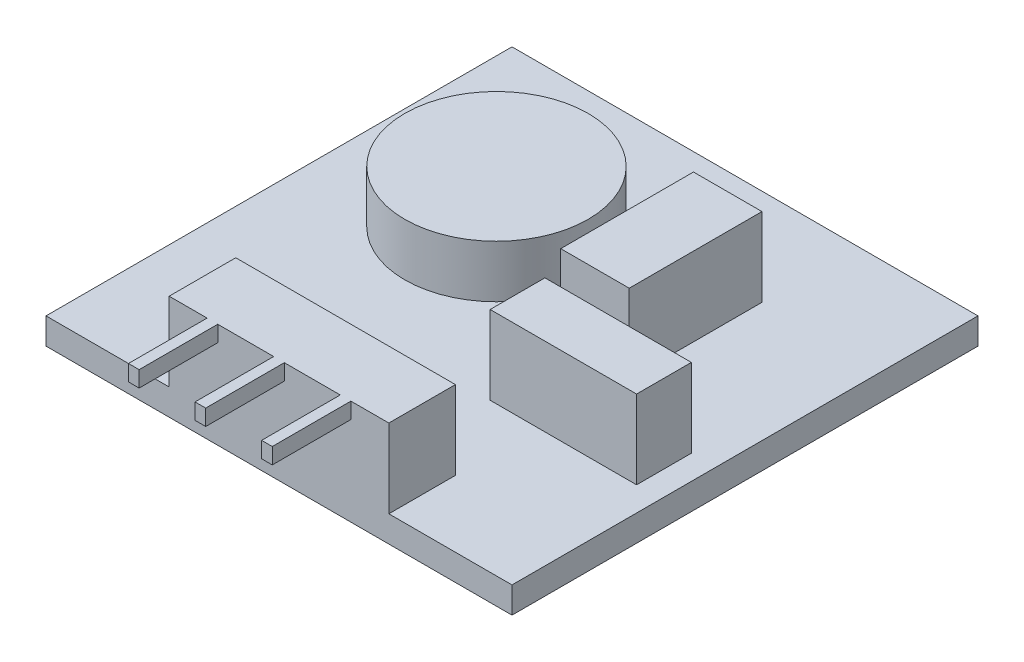
ISO-10303-21;
HEADER;
FILE_DESCRIPTION(('STEP AP214'),'2;1');
FILE_NAME('part.step','',(''),(''),'','','');
FILE_SCHEMA(('AUTOMOTIVE_DESIGN { 1 0 10303 214 1 1 1 1 }'));
ENDSEC;
DATA;
#1=APPLICATION_CONTEXT('core data for automotive mechanical design processes');
#2=APPLICATION_PROTOCOL_DEFINITION('international standard','automotive_design',2000,#1);
#3=PRODUCT_CONTEXT('',#1,'mechanical');
#4=PRODUCT('Part','Part','',(#3));
#5=PRODUCT_RELATED_PRODUCT_CATEGORY('part','',(#4));
#6=PRODUCT_DEFINITION_FORMATION('','',#4);
#7=PRODUCT_DEFINITION_CONTEXT('part definition',#1,'design');
#8=PRODUCT_DEFINITION('design','',#6,#7);
#9=PRODUCT_DEFINITION_SHAPE('','',#8);
#10=(LENGTH_UNIT() NAMED_UNIT(*) SI_UNIT(.MILLI.,.METRE.));
#11=(NAMED_UNIT(*) PLANE_ANGLE_UNIT() SI_UNIT($,.RADIAN.));
#12=(NAMED_UNIT(*) SI_UNIT($,.STERADIAN.) SOLID_ANGLE_UNIT());
#13=UNCERTAINTY_MEASURE_WITH_UNIT(LENGTH_MEASURE(1.E-05),#10,'distance_accuracy_value','');
#14=(GEOMETRIC_REPRESENTATION_CONTEXT(3) GLOBAL_UNCERTAINTY_ASSIGNED_CONTEXT((#13)) GLOBAL_UNIT_ASSIGNED_CONTEXT((#10,
#11,#12)) REPRESENTATION_CONTEXT('',''));
#15=CARTESIAN_POINT('',(0.,0.,0.));
#16=DIRECTION('',(0.,0.,1.));
#17=DIRECTION('',(1.,0.,0.));
#18=AXIS2_PLACEMENT_3D('',#15,#16,#17);
#19=CARTESIAN_POINT('',(-8.89,1.,8.89));
#20=DIRECTION('',(0.,0.,-1.));
#21=DIRECTION('',(-1.,0.,0.));
#22=AXIS2_PLACEMENT_3D('',#19,#20,#21);
#23=PLANE('',#22);
#24=DIRECTION('',(0.,1.,0.));
#25=VECTOR('',#24,1.);
#26=CARTESIAN_POINT('',(2.7432,4.,8.89));
#27=LINE('',#26,#25);
#28=CARTESIAN_POINT('',(2.7432,3.3904,8.89));
#29=VERTEX_POINT('',#28);
#30=CARTESIAN_POINT('',(2.7432,4.,8.89));
#31=VERTEX_POINT('',#30);
#32=EDGE_CURVE('E51',#29,#31,#27,.T.);
#33=ORIENTED_EDGE('',*,*,#32,.F.);
#34=DIRECTION('',(1.,0.,0.));
#35=VECTOR('',#34,1.);
#36=CARTESIAN_POINT('',(2.3368,3.3904,8.89));
#37=LINE('',#36,#35);
#38=CARTESIAN_POINT('',(2.3368,3.3904,8.89));
#39=VERTEX_POINT('',#38);
#40=EDGE_CURVE('E242',#39,#29,#37,.T.);
#41=ORIENTED_EDGE('',*,*,#40,.F.);
#42=DIRECTION('',(0.,-1.,0.));
#43=VECTOR('',#42,1.);
#44=CARTESIAN_POINT('',(2.3368,4.,8.89));
#45=LINE('',#44,#43);
#46=CARTESIAN_POINT('',(2.3368,4.,8.89));
#47=VERTEX_POINT('',#46);
#48=EDGE_CURVE('E680',#47,#39,#45,.T.);
#49=ORIENTED_EDGE('',*,*,#48,.F.);
#50=DIRECTION('',(1.,0.,0.));
#51=VECTOR('',#50,1.);
#52=CARTESIAN_POINT('',(-4.191,4.,8.89));
#53=LINE('',#52,#51);
#54=CARTESIAN_POINT('',(0.203200000000001,4.,8.89));
#55=VERTEX_POINT('',#54);
#56=EDGE_CURVE('E294',#55,#47,#53,.T.);
#57=ORIENTED_EDGE('',*,*,#56,.F.);
#58=DIRECTION('',(0.,1.,0.));
#59=VECTOR('',#58,1.);
#60=CARTESIAN_POINT('',(0.203200000000002,4.,8.89));
#61=LINE('',#60,#59);
#62=CARTESIAN_POINT('',(0.203200000000002,3.3904,8.89));
#63=VERTEX_POINT('',#62);
#64=EDGE_CURVE('E59',#63,#55,#61,.T.);
#65=ORIENTED_EDGE('',*,*,#64,.F.);
#66=DIRECTION('',(1.,0.,0.));
#67=VECTOR('',#66,1.);
#68=CARTESIAN_POINT('',(-0.203199999999998,3.3904,8.89));
#69=LINE('',#68,#67);
#70=CARTESIAN_POINT('',(-0.203199999999998,3.3904,8.89));
#71=VERTEX_POINT('',#70);
#72=EDGE_CURVE('E256',#71,#63,#69,.T.);
#73=ORIENTED_EDGE('',*,*,#72,.F.);
#74=DIRECTION('',(0.,-1.,0.));
#75=VECTOR('',#74,1.);
#76=CARTESIAN_POINT('',(-0.203199999999998,4.,8.89));
#77=LINE('',#76,#75);
#78=CARTESIAN_POINT('',(-0.203199999999998,4.,8.89));
#79=VERTEX_POINT('',#78);
#80=EDGE_CURVE('E246',#79,#71,#77,.T.);
#81=ORIENTED_EDGE('',*,*,#80,.F.);
#82=CARTESIAN_POINT('',(-2.3368,4.,8.89));
#83=VERTEX_POINT('',#82);
#84=EDGE_CURVE('E295',#83,#79,#53,.T.);
#85=ORIENTED_EDGE('',*,*,#84,.F.);
#86=DIRECTION('',(0.,1.,0.));
#87=VECTOR('',#86,1.);
#88=CARTESIAN_POINT('',(-2.3368,4.,8.89));
#89=LINE('',#88,#87);
#90=CARTESIAN_POINT('',(-2.3368,3.3904,8.89));
#91=VERTEX_POINT('',#90);
#92=EDGE_CURVE('E273',#91,#83,#89,.T.);
#93=ORIENTED_EDGE('',*,*,#92,.F.);
#94=DIRECTION('',(1.,0.,0.));
#95=VECTOR('',#94,1.);
#96=CARTESIAN_POINT('',(-2.7432,3.3904,8.89));
#97=LINE('',#96,#95);
#98=CARTESIAN_POINT('',(-2.7432,3.3904,8.89));
#99=VERTEX_POINT('',#98);
#100=EDGE_CURVE('E278',#99,#91,#97,.T.);
#101=ORIENTED_EDGE('',*,*,#100,.F.);
#102=DIRECTION('',(0.,-1.,0.));
#103=VECTOR('',#102,1.);
#104=CARTESIAN_POINT('',(-2.7432,4.,8.89));
#105=LINE('',#104,#103);
#106=CARTESIAN_POINT('',(-2.7432,4.,8.89));
#107=VERTEX_POINT('',#106);
#108=EDGE_CURVE('E291',#107,#99,#105,.T.);
#109=ORIENTED_EDGE('',*,*,#108,.F.);
#110=CARTESIAN_POINT('',(-4.191,4.,8.89));
#111=VERTEX_POINT('',#110);
#112=EDGE_CURVE('E309',#111,#107,#53,.T.);
#113=ORIENTED_EDGE('',*,*,#112,.F.);
#114=DIRECTION('',(0.,-1.,0.));
#115=VECTOR('',#114,1.);
#116=CARTESIAN_POINT('',(-4.191,4.,8.89));
#117=LINE('',#116,#115);
#118=CARTESIAN_POINT('',(-4.191,1.,8.89));
#119=VERTEX_POINT('',#118);
#120=EDGE_CURVE('E418',#111,#119,#117,.T.);
#121=ORIENTED_EDGE('',*,*,#120,.T.);
#122=DIRECTION('',(1.,0.,0.));
#123=VECTOR('',#122,1.);
#124=CARTESIAN_POINT('',(-8.89,1.,8.89));
#125=LINE('',#124,#123);
#126=CARTESIAN_POINT('',(-8.89,1.,8.89));
#127=VERTEX_POINT('',#126);
#128=EDGE_CURVE('E324',#127,#119,#125,.T.);
#129=ORIENTED_EDGE('',*,*,#128,.F.);
#130=DIRECTION('',(0.,-1.,0.));
#131=VECTOR('',#130,1.);
#132=CARTESIAN_POINT('',(-8.89,1.,8.89));
#133=LINE('',#132,#131);
#134=CARTESIAN_POINT('',(-8.89,0.,8.89));
#135=VERTEX_POINT('',#134);
#136=EDGE_CURVE('E318',#127,#135,#133,.T.);
#137=ORIENTED_EDGE('',*,*,#136,.T.);
#138=DIRECTION('',(1.,0.,0.));
#139=VECTOR('',#138,1.);
#140=CARTESIAN_POINT('',(-8.89,0.,8.89));
#141=LINE('',#140,#139);
#142=CARTESIAN_POINT('',(8.89,0.,8.89));
#143=VERTEX_POINT('',#142);
#144=EDGE_CURVE('E325',#135,#143,#141,.T.);
#145=ORIENTED_EDGE('',*,*,#144,.T.);
#146=DIRECTION('',(0.,-1.,0.));
#147=VECTOR('',#146,1.);
#148=CARTESIAN_POINT('',(8.89,1.,8.89));
#149=LINE('',#148,#147);
#150=CARTESIAN_POINT('',(8.89,1.,8.89));
#151=VERTEX_POINT('',#150);
#152=EDGE_CURVE('E321',#151,#143,#149,.T.);
#153=ORIENTED_EDGE('',*,*,#152,.F.);
#154=CARTESIAN_POINT('',(4.191,1.,8.89));
#155=VERTEX_POINT('',#154);
#156=EDGE_CURVE('E337',#155,#151,#125,.T.);
#157=ORIENTED_EDGE('',*,*,#156,.F.);
#158=DIRECTION('',(0.,-1.,0.));
#159=VECTOR('',#158,1.);
#160=CARTESIAN_POINT('',(4.191,4.,8.89));
#161=LINE('',#160,#159);
#162=CARTESIAN_POINT('',(4.191,4.,8.89));
#163=VERTEX_POINT('',#162);
#164=EDGE_CURVE('E311',#163,#155,#161,.T.);
#165=ORIENTED_EDGE('',*,*,#164,.F.);
#166=EDGE_CURVE('E37',#31,#163,#53,.T.);
#167=ORIENTED_EDGE('',*,*,#166,.F.);
#168=EDGE_LOOP('',(#33,#41,#49,#57,#65,#73,#81,#85,#93,#101,#109,#113,#121,#129,#137,#145,#153,
#157,#165,#167));
#169=FACE_BOUND('',#168,.T.);
#170=ADVANCED_FACE('F33',(#169),#23,.F.);
#171=CARTESIAN_POINT('',(0.,1.,0.));
#172=DIRECTION('',(0.,-1.,0.));
#173=DIRECTION('',(0.,0.,-1.));
#174=AXIS2_PLACEMENT_3D('',#171,#172,#173);
#175=PLANE('',#174);
#176=DIRECTION('',(0.,0.,-1.));
#177=VECTOR('',#176,1.);
#178=CARTESIAN_POINT('',(4.32151695929847,1.,-0.150750591603429));
#179=LINE('',#178,#177);
#180=CARTESIAN_POINT('',(4.32151695929847,1.,-0.150750591603429));
#181=VERTEX_POINT('',#180);
#182=CARTESIAN_POINT('',(4.32151695929847,1.,-5.21597046947885));
#183=VERTEX_POINT('',#182);
#184=EDGE_CURVE('E402',#181,#183,#179,.T.);
#185=ORIENTED_EDGE('',*,*,#184,.F.);
#186=DIRECTION('',(1.,0.,0.));
#187=VECTOR('',#186,1.);
#188=CARTESIAN_POINT('',(1.70850670483893,1.,-0.150750591603429));
#189=LINE('',#188,#187);
#190=CARTESIAN_POINT('',(1.70850670483893,1.,-0.150750591603429));
#191=VERTEX_POINT('',#190);
#192=EDGE_CURVE('E392',#191,#181,#189,.T.);
#193=ORIENTED_EDGE('',*,*,#192,.F.);
#194=DIRECTION('',(0.,0.,1.));
#195=VECTOR('',#194,1.);
#196=CARTESIAN_POINT('',(1.70850670483893,1.,-0.150750591603429));
#197=LINE('',#196,#195);
#198=CARTESIAN_POINT('',(1.70850670483893,1.,-5.21597046947885));
#199=VERTEX_POINT('',#198);
#200=EDGE_CURVE('E396',#199,#191,#197,.T.);
#201=ORIENTED_EDGE('',*,*,#200,.F.);
#202=DIRECTION('',(-1.,0.,0.));
#203=VECTOR('',#202,1.);
#204=CARTESIAN_POINT('',(1.70850670483893,1.,-5.21597046947885));
#205=LINE('',#204,#203);
#206=EDGE_CURVE('E399',#183,#199,#205,.T.);
#207=ORIENTED_EDGE('',*,*,#206,.F.);
#208=EDGE_LOOP('',(#185,#193,#201,#207));
#209=FACE_BOUND('',#208,.T.);
#210=CARTESIAN_POINT('',(-3.23611269975375,1.,-2.64316037278023));
#211=DIRECTION('',(0.,-1.,0.));
#212=DIRECTION('',(0.,0.,-1.));
#213=AXIS2_PLACEMENT_3D('',#210,#211,#212);
#214=CIRCLE('',#213,3.5);
#215=CARTESIAN_POINT('',(-3.23611269975375,1.,-6.14316037278023));
#216=VERTEX_POINT('',#215);
#217=EDGE_CURVE('E11',#216,#216,#214,.F.);
#218=ORIENTED_EDGE('',*,*,#217,.F.);
#219=EDGE_LOOP('',(#218));
#220=FACE_BOUND('',#219,.T.);
#221=DIRECTION('',(0.,0.,-1.));
#222=VECTOR('',#221,1.);
#223=CARTESIAN_POINT('',(7.95963123666137,1.,1.11555437786543));
#224=LINE('',#223,#222);
#225=CARTESIAN_POINT('',(7.95963123666137,1.,3.20596258143306));
#226=VERTEX_POINT('',#225);
#227=CARTESIAN_POINT('',(7.95963123666137,1.,1.11555437786543));
#228=VERTEX_POINT('',#227);
#229=EDGE_CURVE('E369',#226,#228,#224,.T.);
#230=ORIENTED_EDGE('',*,*,#229,.F.);
#231=DIRECTION('',(1.,0.,0.));
#232=VECTOR('',#231,1.);
#233=CARTESIAN_POINT('',(2.37180930789404,1.,3.20596258143306));
#234=LINE('',#233,#232);
#235=CARTESIAN_POINT('',(2.37180930789404,1.,3.20596258143306));
#236=VERTEX_POINT('',#235);
#237=EDGE_CURVE('E359',#236,#226,#234,.T.);
#238=ORIENTED_EDGE('',*,*,#237,.F.);
#239=DIRECTION('',(0.,0.,1.));
#240=VECTOR('',#239,1.);
#241=CARTESIAN_POINT('',(2.37180930789404,1.,1.11555437786543));
#242=LINE('',#241,#240);
#243=CARTESIAN_POINT('',(2.37180930789404,1.,1.11555437786543));
#244=VERTEX_POINT('',#243);
#245=EDGE_CURVE('E363',#244,#236,#242,.T.);
#246=ORIENTED_EDGE('',*,*,#245,.F.);
#247=DIRECTION('',(-1.,0.,0.));
#248=VECTOR('',#247,1.);
#249=CARTESIAN_POINT('',(2.37180930789404,1.,1.11555437786543));
#250=LINE('',#249,#248);
#251=EDGE_CURVE('E366',#228,#244,#250,.T.);
#252=ORIENTED_EDGE('',*,*,#251,.F.);
#253=EDGE_LOOP('',(#230,#238,#246,#252));
#254=FACE_BOUND('',#253,.T.);
#255=DIRECTION('',(0.,0.,-1.));
#256=VECTOR('',#255,1.);
#257=CARTESIAN_POINT('',(4.191,1.,6.35));
#258=LINE('',#257,#256);
#259=CARTESIAN_POINT('',(4.191,1.,6.35));
#260=VERTEX_POINT('',#259);
#261=EDGE_CURVE('E301',#155,#260,#258,.T.);
#262=ORIENTED_EDGE('',*,*,#261,.F.);
#263=ORIENTED_EDGE('',*,*,#156,.T.);
#264=DIRECTION('',(0.,0.,-1.));
#265=VECTOR('',#264,1.);
#266=CARTESIAN_POINT('',(8.89,1.,8.89));
#267=LINE('',#266,#265);
#268=CARTESIAN_POINT('',(8.89,1.,-8.89));
#269=VERTEX_POINT('',#268);
#270=EDGE_CURVE('E327',#151,#269,#267,.T.);
#271=ORIENTED_EDGE('',*,*,#270,.T.);
#272=DIRECTION('',(-1.,0.,0.));
#273=VECTOR('',#272,1.);
#274=CARTESIAN_POINT('',(-8.89,1.,-8.89));
#275=LINE('',#274,#273);
#276=CARTESIAN_POINT('',(-8.89,1.,-8.89));
#277=VERTEX_POINT('',#276);
#278=EDGE_CURVE('E340',#269,#277,#275,.T.);
#279=ORIENTED_EDGE('',*,*,#278,.T.);
#280=DIRECTION('',(0.,0.,1.));
#281=VECTOR('',#280,1.);
#282=CARTESIAN_POINT('',(-8.89,1.,8.89));
#283=LINE('',#282,#281);
#284=EDGE_CURVE('E338',#277,#127,#283,.T.);
#285=ORIENTED_EDGE('',*,*,#284,.T.);
#286=ORIENTED_EDGE('',*,*,#128,.T.);
#287=DIRECTION('',(0.,0.,1.));
#288=VECTOR('',#287,1.);
#289=CARTESIAN_POINT('',(-4.191,1.,6.35));
#290=LINE('',#289,#288);
#291=CARTESIAN_POINT('',(-4.191,1.,6.35));
#292=VERTEX_POINT('',#291);
#293=EDGE_CURVE('E423',#292,#119,#290,.T.);
#294=ORIENTED_EDGE('',*,*,#293,.F.);
#295=DIRECTION('',(-1.,0.,0.));
#296=VECTOR('',#295,1.);
#297=CARTESIAN_POINT('',(-4.191,1.,6.35));
#298=LINE('',#297,#296);
#299=EDGE_CURVE('E426',#260,#292,#298,.T.);
#300=ORIENTED_EDGE('',*,*,#299,.F.);
#301=EDGE_LOOP('',(#262,#263,#271,#279,#285,#286,#294,#300));
#302=FACE_BOUND('',#301,.T.);
#303=ADVANCED_FACE('F490',(#209,#220,#254,#302),#175,.F.);
#304=CARTESIAN_POINT('',(8.89,1.,8.89));
#305=DIRECTION('',(-1.,0.,0.));
#306=DIRECTION('',(0.,0.,1.));
#307=AXIS2_PLACEMENT_3D('',#304,#305,#306);
#308=PLANE('',#307);
#309=DIRECTION('',(0.,0.,-1.));
#310=VECTOR('',#309,1.);
#311=CARTESIAN_POINT('',(8.89,0.,8.89));
#312=LINE('',#311,#310);
#313=CARTESIAN_POINT('',(8.89,0.,-8.89));
#314=VERTEX_POINT('',#313);
#315=EDGE_CURVE('E332',#143,#314,#312,.T.);
#316=ORIENTED_EDGE('',*,*,#315,.T.);
#317=DIRECTION('',(0.,-1.,0.));
#318=VECTOR('',#317,1.);
#319=CARTESIAN_POINT('',(8.89,1.,-8.89));
#320=LINE('',#319,#318);
#321=EDGE_CURVE('E43',#269,#314,#320,.T.);
#322=ORIENTED_EDGE('',*,*,#321,.F.);
#323=ORIENTED_EDGE('',*,*,#270,.F.);
#324=ORIENTED_EDGE('',*,*,#152,.T.);
#325=EDGE_LOOP('',(#316,#322,#323,#324));
#326=FACE_BOUND('',#325,.T.);
#327=ADVANCED_FACE('F35',(#326),#308,.F.);
#328=CARTESIAN_POINT('',(-8.89,1.,-8.89));
#329=DIRECTION('',(0.,0.,1.));
#330=DIRECTION('',(1.,0.,0.));
#331=AXIS2_PLACEMENT_3D('',#328,#329,#330);
#332=PLANE('',#331);
#333=DIRECTION('',(-1.,0.,0.));
#334=VECTOR('',#333,1.);
#335=CARTESIAN_POINT('',(-8.89,0.,-8.89));
#336=LINE('',#335,#334);
#337=CARTESIAN_POINT('',(-8.89,0.,-8.89));
#338=VERTEX_POINT('',#337);
#339=EDGE_CURVE('E330',#314,#338,#336,.T.);
#340=ORIENTED_EDGE('',*,*,#339,.T.);
#341=DIRECTION('',(0.,-1.,0.));
#342=VECTOR('',#341,1.);
#343=CARTESIAN_POINT('',(-8.89,1.,-8.89));
#344=LINE('',#343,#342);
#345=EDGE_CURVE('E315',#277,#338,#344,.T.);
#346=ORIENTED_EDGE('',*,*,#345,.F.);
#347=ORIENTED_EDGE('',*,*,#278,.F.);
#348=ORIENTED_EDGE('',*,*,#321,.T.);
#349=EDGE_LOOP('',(#340,#346,#347,#348));
#350=FACE_BOUND('',#349,.T.);
#351=ADVANCED_FACE('F504',(#350),#332,.F.);
#352=CARTESIAN_POINT('',(-8.89,1.,8.89));
#353=DIRECTION('',(1.,0.,0.));
#354=DIRECTION('',(0.,0.,-1.));
#355=AXIS2_PLACEMENT_3D('',#352,#353,#354);
#356=PLANE('',#355);
#357=DIRECTION('',(0.,0.,1.));
#358=VECTOR('',#357,1.);
#359=CARTESIAN_POINT('',(-8.89,0.,8.89));
#360=LINE('',#359,#358);
#361=EDGE_CURVE('E328',#338,#135,#360,.T.);
#362=ORIENTED_EDGE('',*,*,#361,.T.);
#363=ORIENTED_EDGE('',*,*,#136,.F.);
#364=ORIENTED_EDGE('',*,*,#284,.F.);
#365=ORIENTED_EDGE('',*,*,#345,.T.);
#366=EDGE_LOOP('',(#362,#363,#364,#365));
#367=FACE_BOUND('',#366,.T.);
#368=ADVANCED_FACE('F502',(#367),#356,.F.);
#369=CARTESIAN_POINT('',(0.,0.,0.));
#370=DIRECTION('',(0.,-1.,0.));
#371=DIRECTION('',(0.,0.,-1.));
#372=AXIS2_PLACEMENT_3D('',#369,#370,#371);
#373=PLANE('',#372);
#374=ORIENTED_EDGE('',*,*,#315,.F.);
#375=ORIENTED_EDGE('',*,*,#144,.F.);
#376=ORIENTED_EDGE('',*,*,#361,.F.);
#377=ORIENTED_EDGE('',*,*,#339,.F.);
#378=EDGE_LOOP('',(#374,#375,#376,#377));
#379=FACE_BOUND('',#378,.T.);
#380=ADVANCED_FACE('F501',(#379),#373,.T.);
#381=CARTESIAN_POINT('',(-3.23611269975375,3.,-2.64316037278023));
#382=DIRECTION('',(0.,-1.,0.));
#383=DIRECTION('',(0.,0.,-1.));
#384=AXIS2_PLACEMENT_3D('',#381,#382,#383);
#385=CYLINDRICAL_SURFACE('',#384,3.5);
#386=CARTESIAN_POINT('',(-3.23611269975375,3.,-2.64316037278023));
#387=DIRECTION('',(0.,1.,0.));
#388=DIRECTION('',(0.,0.,1.));
#389=AXIS2_PLACEMENT_3D('',#386,#387,#388);
#390=CIRCLE('',#389,3.5);
#391=CARTESIAN_POINT('',(-3.23611269975375,3.,0.85683962721977));
#392=VERTEX_POINT('',#391);
#393=EDGE_CURVE('E335',#392,#392,#390,.T.);
#394=ORIENTED_EDGE('',*,*,#393,.F.);
#395=EDGE_LOOP('',(#394));
#396=FACE_BOUND('',#395,.T.);
#397=ORIENTED_EDGE('',*,*,#217,.T.);
#398=EDGE_LOOP('',(#397));
#399=FACE_BOUND('',#398,.T.);
#400=ADVANCED_FACE('F523',(#396,#399),#385,.T.);
#401=CARTESIAN_POINT('',(-3.23611269975375,3.,-2.64316037278023));
#402=DIRECTION('',(0.,1.,0.));
#403=DIRECTION('',(0.,0.,1.));
#404=AXIS2_PLACEMENT_3D('',#401,#402,#403);
#405=PLANE('',#404);
#406=ORIENTED_EDGE('',*,*,#393,.T.);
#407=EDGE_LOOP('',(#406));
#408=FACE_BOUND('',#407,.T.);
#409=ADVANCED_FACE('F527',(#408),#405,.T.);
#410=CARTESIAN_POINT('',(7.95963123666137,4.,1.11555437786543));
#411=DIRECTION('',(-1.,0.,0.));
#412=DIRECTION('',(0.,0.,1.));
#413=AXIS2_PLACEMENT_3D('',#410,#411,#412);
#414=PLANE('',#413);
#415=ORIENTED_EDGE('',*,*,#229,.T.);
#416=DIRECTION('',(0.,-1.,0.));
#417=VECTOR('',#416,1.);
#418=CARTESIAN_POINT('',(7.95963123666137,4.,1.11555437786543));
#419=LINE('',#418,#417);
#420=CARTESIAN_POINT('',(7.95963123666137,4.,1.11555437786543));
#421=VERTEX_POINT('',#420);
#422=EDGE_CURVE('E346',#421,#228,#419,.T.);
#423=ORIENTED_EDGE('',*,*,#422,.F.);
#424=DIRECTION('',(0.,0.,-1.));
#425=VECTOR('',#424,1.);
#426=CARTESIAN_POINT('',(7.95963123666137,4.,1.11555437786543));
#427=LINE('',#426,#425);
#428=CARTESIAN_POINT('',(7.95963123666137,4.,3.20596258143306));
#429=VERTEX_POINT('',#428);
#430=EDGE_CURVE('E362',#429,#421,#427,.T.);
#431=ORIENTED_EDGE('',*,*,#430,.F.);
#432=DIRECTION('',(0.,-1.,0.));
#433=VECTOR('',#432,1.);
#434=CARTESIAN_POINT('',(7.95963123666137,4.,3.20596258143306));
#435=LINE('',#434,#433);
#436=EDGE_CURVE('E355',#429,#226,#435,.T.);
#437=ORIENTED_EDGE('',*,*,#436,.T.);
#438=EDGE_LOOP('',(#415,#423,#431,#437));
#439=FACE_BOUND('',#438,.T.);
#440=ADVANCED_FACE('F533',(#439),#414,.F.);
#441=CARTESIAN_POINT('',(2.37180930789404,4.,1.11555437786543));
#442=DIRECTION('',(0.,0.,1.));
#443=DIRECTION('',(1.,0.,0.));
#444=AXIS2_PLACEMENT_3D('',#441,#442,#443);
#445=PLANE('',#444);
#446=ORIENTED_EDGE('',*,*,#251,.T.);
#447=DIRECTION('',(0.,-1.,0.));
#448=VECTOR('',#447,1.);
#449=CARTESIAN_POINT('',(2.37180930789404,4.,1.11555437786543));
#450=LINE('',#449,#448);
#451=CARTESIAN_POINT('',(2.37180930789404,4.,1.11555437786543));
#452=VERTEX_POINT('',#451);
#453=EDGE_CURVE('E349',#452,#244,#450,.T.);
#454=ORIENTED_EDGE('',*,*,#453,.F.);
#455=DIRECTION('',(-1.,0.,0.));
#456=VECTOR('',#455,1.);
#457=CARTESIAN_POINT('',(2.37180930789404,4.,1.11555437786543));
#458=LINE('',#457,#456);
#459=EDGE_CURVE('E376',#421,#452,#458,.T.);
#460=ORIENTED_EDGE('',*,*,#459,.F.);
#461=ORIENTED_EDGE('',*,*,#422,.T.);
#462=EDGE_LOOP('',(#446,#454,#460,#461));
#463=FACE_BOUND('',#462,.T.);
#464=ADVANCED_FACE('F541',(#463),#445,.F.);
#465=CARTESIAN_POINT('',(2.37180930789404,4.,1.11555437786543));
#466=DIRECTION('',(1.,0.,0.));
#467=DIRECTION('',(0.,0.,-1.));
#468=AXIS2_PLACEMENT_3D('',#465,#466,#467);
#469=PLANE('',#468);
#470=ORIENTED_EDGE('',*,*,#245,.T.);
#471=DIRECTION('',(0.,-1.,0.));
#472=VECTOR('',#471,1.);
#473=CARTESIAN_POINT('',(2.37180930789404,4.,3.20596258143306));
#474=LINE('',#473,#472);
#475=CARTESIAN_POINT('',(2.37180930789404,4.,3.20596258143306));
#476=VERTEX_POINT('',#475);
#477=EDGE_CURVE('E352',#476,#236,#474,.T.);
#478=ORIENTED_EDGE('',*,*,#477,.F.);
#479=DIRECTION('',(0.,0.,1.));
#480=VECTOR('',#479,1.);
#481=CARTESIAN_POINT('',(2.37180930789404,4.,1.11555437786543));
#482=LINE('',#481,#480);
#483=EDGE_CURVE('E374',#452,#476,#482,.T.);
#484=ORIENTED_EDGE('',*,*,#483,.F.);
#485=ORIENTED_EDGE('',*,*,#453,.T.);
#486=EDGE_LOOP('',(#470,#478,#484,#485));
#487=FACE_BOUND('',#486,.T.);
#488=ADVANCED_FACE('F545',(#487),#469,.F.);
#489=CARTESIAN_POINT('',(2.37180930789404,4.,3.20596258143306));
#490=DIRECTION('',(0.,0.,-1.));
#491=DIRECTION('',(-1.,0.,0.));
#492=AXIS2_PLACEMENT_3D('',#489,#490,#491);
#493=PLANE('',#492);
#494=ORIENTED_EDGE('',*,*,#237,.T.);
#495=ORIENTED_EDGE('',*,*,#436,.F.);
#496=DIRECTION('',(1.,0.,0.));
#497=VECTOR('',#496,1.);
#498=CARTESIAN_POINT('',(2.37180930789404,4.,3.20596258143306));
#499=LINE('',#498,#497);
#500=EDGE_CURVE('E358',#476,#429,#499,.T.);
#501=ORIENTED_EDGE('',*,*,#500,.F.);
#502=ORIENTED_EDGE('',*,*,#477,.T.);
#503=EDGE_LOOP('',(#494,#495,#501,#502));
#504=FACE_BOUND('',#503,.T.);
#505=ADVANCED_FACE('F549',(#504),#493,.F.);
#506=CARTESIAN_POINT('',(0.,4.,0.));
#507=DIRECTION('',(0.,1.,0.));
#508=DIRECTION('',(0.,0.,1.));
#509=AXIS2_PLACEMENT_3D('',#506,#507,#508);
#510=PLANE('',#509);
#511=ORIENTED_EDGE('',*,*,#430,.T.);
#512=ORIENTED_EDGE('',*,*,#459,.T.);
#513=ORIENTED_EDGE('',*,*,#483,.T.);
#514=ORIENTED_EDGE('',*,*,#500,.T.);
#515=EDGE_LOOP('',(#511,#512,#513,#514));
#516=FACE_BOUND('',#515,.T.);
#517=ADVANCED_FACE('F553',(#516),#510,.T.);
#518=CARTESIAN_POINT('',(4.32151695929847,4.,-0.150750591603429));
#519=DIRECTION('',(-1.,0.,0.));
#520=DIRECTION('',(0.,0.,1.));
#521=AXIS2_PLACEMENT_3D('',#518,#519,#520);
#522=PLANE('',#521);
#523=ORIENTED_EDGE('',*,*,#184,.T.);
#524=DIRECTION('',(0.,-1.,0.));
#525=VECTOR('',#524,1.);
#526=CARTESIAN_POINT('',(4.32151695929847,4.,-5.21597046947885));
#527=LINE('',#526,#525);
#528=CARTESIAN_POINT('',(4.32151695929847,4.,-5.21597046947885));
#529=VERTEX_POINT('',#528);
#530=EDGE_CURVE('E372',#529,#183,#527,.T.);
#531=ORIENTED_EDGE('',*,*,#530,.F.);
#532=DIRECTION('',(0.,0.,-1.));
#533=VECTOR('',#532,1.);
#534=CARTESIAN_POINT('',(4.32151695929847,4.,-0.150750591603429));
#535=LINE('',#534,#533);
#536=CARTESIAN_POINT('',(4.32151695929847,4.,-0.150750591603429));
#537=VERTEX_POINT('',#536);
#538=EDGE_CURVE('E395',#537,#529,#535,.T.);
#539=ORIENTED_EDGE('',*,*,#538,.F.);
#540=DIRECTION('',(0.,-1.,0.));
#541=VECTOR('',#540,1.);
#542=CARTESIAN_POINT('',(4.32151695929847,4.,-0.150750591603429));
#543=LINE('',#542,#541);
#544=EDGE_CURVE('E388',#537,#181,#543,.T.);
#545=ORIENTED_EDGE('',*,*,#544,.T.);
#546=EDGE_LOOP('',(#523,#531,#539,#545));
#547=FACE_BOUND('',#546,.T.);
#548=ADVANCED_FACE('F557',(#547),#522,.F.);
#549=CARTESIAN_POINT('',(1.70850670483893,4.,-5.21597046947885));
#550=DIRECTION('',(0.,0.,1.));
#551=DIRECTION('',(1.,0.,0.));
#552=AXIS2_PLACEMENT_3D('',#549,#550,#551);
#553=PLANE('',#552);
#554=ORIENTED_EDGE('',*,*,#206,.T.);
#555=DIRECTION('',(0.,-1.,0.));
#556=VECTOR('',#555,1.);
#557=CARTESIAN_POINT('',(1.70850670483893,4.,-5.21597046947885));
#558=LINE('',#557,#556);
#559=CARTESIAN_POINT('',(1.70850670483893,4.,-5.21597046947885));
#560=VERTEX_POINT('',#559);
#561=EDGE_CURVE('E382',#560,#199,#558,.T.);
#562=ORIENTED_EDGE('',*,*,#561,.F.);
#563=DIRECTION('',(-1.,0.,0.));
#564=VECTOR('',#563,1.);
#565=CARTESIAN_POINT('',(1.70850670483893,4.,-5.21597046947885));
#566=LINE('',#565,#564);
#567=EDGE_CURVE('E409',#529,#560,#566,.T.);
#568=ORIENTED_EDGE('',*,*,#567,.F.);
#569=ORIENTED_EDGE('',*,*,#530,.T.);
#570=EDGE_LOOP('',(#554,#562,#568,#569));
#571=FACE_BOUND('',#570,.T.);
#572=ADVANCED_FACE('F561',(#571),#553,.F.);
#573=CARTESIAN_POINT('',(1.70850670483893,4.,-0.150750591603429));
#574=DIRECTION('',(1.,0.,0.));
#575=DIRECTION('',(0.,0.,-1.));
#576=AXIS2_PLACEMENT_3D('',#573,#574,#575);
#577=PLANE('',#576);
#578=ORIENTED_EDGE('',*,*,#200,.T.);
#579=DIRECTION('',(0.,-1.,0.));
#580=VECTOR('',#579,1.);
#581=CARTESIAN_POINT('',(1.70850670483893,4.,-0.150750591603429));
#582=LINE('',#581,#580);
#583=CARTESIAN_POINT('',(1.70850670483893,4.,-0.150750591603429));
#584=VERTEX_POINT('',#583);
#585=EDGE_CURVE('E385',#584,#191,#582,.T.);
#586=ORIENTED_EDGE('',*,*,#585,.F.);
#587=DIRECTION('',(0.,0.,1.));
#588=VECTOR('',#587,1.);
#589=CARTESIAN_POINT('',(1.70850670483893,4.,-0.150750591603429));
#590=LINE('',#589,#588);
#591=EDGE_CURVE('E407',#560,#584,#590,.T.);
#592=ORIENTED_EDGE('',*,*,#591,.F.);
#593=ORIENTED_EDGE('',*,*,#561,.T.);
#594=EDGE_LOOP('',(#578,#586,#592,#593));
#595=FACE_BOUND('',#594,.T.);
#596=ADVANCED_FACE('F565',(#595),#577,.F.);
#597=CARTESIAN_POINT('',(1.70850670483893,4.,-0.150750591603429));
#598=DIRECTION('',(0.,0.,-1.));
#599=DIRECTION('',(-1.,0.,0.));
#600=AXIS2_PLACEMENT_3D('',#597,#598,#599);
#601=PLANE('',#600);
#602=ORIENTED_EDGE('',*,*,#192,.T.);
#603=ORIENTED_EDGE('',*,*,#544,.F.);
#604=DIRECTION('',(1.,0.,0.));
#605=VECTOR('',#604,1.);
#606=CARTESIAN_POINT('',(1.70850670483893,4.,-0.150750591603429));
#607=LINE('',#606,#605);
#608=EDGE_CURVE('E391',#584,#537,#607,.T.);
#609=ORIENTED_EDGE('',*,*,#608,.F.);
#610=ORIENTED_EDGE('',*,*,#585,.T.);
#611=EDGE_LOOP('',(#602,#603,#609,#610));
#612=FACE_BOUND('',#611,.T.);
#613=ADVANCED_FACE('F569',(#612),#601,.F.);
#614=CARTESIAN_POINT('',(0.,4.,0.));
#615=DIRECTION('',(0.,-1.,0.));
#616=DIRECTION('',(0.,0.,-1.));
#617=AXIS2_PLACEMENT_3D('',#614,#615,#616);
#618=PLANE('',#617);
#619=ORIENTED_EDGE('',*,*,#538,.T.);
#620=ORIENTED_EDGE('',*,*,#567,.T.);
#621=ORIENTED_EDGE('',*,*,#591,.T.);
#622=ORIENTED_EDGE('',*,*,#608,.T.);
#623=EDGE_LOOP('',(#619,#620,#621,#622));
#624=FACE_BOUND('',#623,.T.);
#625=ADVANCED_FACE('F573',(#624),#618,.F.);
#626=CARTESIAN_POINT('',(4.191,4.,6.35));
#627=DIRECTION('',(-1.,0.,0.));
#628=DIRECTION('',(0.,0.,1.));
#629=AXIS2_PLACEMENT_3D('',#626,#627,#628);
#630=PLANE('',#629);
#631=ORIENTED_EDGE('',*,*,#261,.T.);
#632=DIRECTION('',(0.,-1.,0.));
#633=VECTOR('',#632,1.);
#634=CARTESIAN_POINT('',(4.191,4.,6.35));
#635=LINE('',#634,#633);
#636=CARTESIAN_POINT('',(4.191,4.,6.35));
#637=VERTEX_POINT('',#636);
#638=EDGE_CURVE('E405',#637,#260,#635,.T.);
#639=ORIENTED_EDGE('',*,*,#638,.F.);
#640=DIRECTION('',(0.,0.,-1.));
#641=VECTOR('',#640,1.);
#642=CARTESIAN_POINT('',(4.191,4.,6.35));
#643=LINE('',#642,#641);
#644=EDGE_CURVE('E425',#163,#637,#643,.T.);
#645=ORIENTED_EDGE('',*,*,#644,.F.);
#646=ORIENTED_EDGE('',*,*,#164,.T.);
#647=EDGE_LOOP('',(#631,#639,#645,#646));
#648=FACE_BOUND('',#647,.T.);
#649=ADVANCED_FACE('F468',(#648),#630,.F.);
#650=CARTESIAN_POINT('',(-4.191,4.,6.35));
#651=DIRECTION('',(0.,0.,1.));
#652=DIRECTION('',(1.,0.,0.));
#653=AXIS2_PLACEMENT_3D('',#650,#651,#652);
#654=PLANE('',#653);
#655=ORIENTED_EDGE('',*,*,#299,.T.);
#656=DIRECTION('',(0.,-1.,0.));
#657=VECTOR('',#656,1.);
#658=CARTESIAN_POINT('',(-4.191,4.,6.35));
#659=LINE('',#658,#657);
#660=CARTESIAN_POINT('',(-4.191,4.,6.35));
#661=VERTEX_POINT('',#660);
#662=EDGE_CURVE('E415',#661,#292,#659,.T.);
#663=ORIENTED_EDGE('',*,*,#662,.F.);
#664=DIRECTION('',(-1.,0.,0.));
#665=VECTOR('',#664,1.);
#666=CARTESIAN_POINT('',(-4.191,4.,6.35));
#667=LINE('',#666,#665);
#668=EDGE_CURVE('E462',#637,#661,#667,.T.);
#669=ORIENTED_EDGE('',*,*,#668,.F.);
#670=ORIENTED_EDGE('',*,*,#638,.T.);
#671=EDGE_LOOP('',(#655,#663,#669,#670));
#672=FACE_BOUND('',#671,.T.);
#673=ADVANCED_FACE('F469',(#672),#654,.F.);
#674=CARTESIAN_POINT('',(-4.191,4.,6.35));
#675=DIRECTION('',(1.,0.,0.));
#676=DIRECTION('',(0.,0.,-1.));
#677=AXIS2_PLACEMENT_3D('',#674,#675,#676);
#678=PLANE('',#677);
#679=ORIENTED_EDGE('',*,*,#293,.T.);
#680=ORIENTED_EDGE('',*,*,#120,.F.);
#681=DIRECTION('',(0.,0.,1.));
#682=VECTOR('',#681,1.);
#683=CARTESIAN_POINT('',(-4.191,4.,6.35));
#684=LINE('',#683,#682);
#685=EDGE_CURVE('E299',#661,#111,#684,.T.);
#686=ORIENTED_EDGE('',*,*,#685,.F.);
#687=ORIENTED_EDGE('',*,*,#662,.T.);
#688=EDGE_LOOP('',(#679,#680,#686,#687));
#689=FACE_BOUND('',#688,.T.);
#690=ADVANCED_FACE('F471',(#689),#678,.F.);
#691=CARTESIAN_POINT('',(0.,4.,0.));
#692=DIRECTION('',(0.,1.,0.));
#693=DIRECTION('',(0.,0.,1.));
#694=AXIS2_PLACEMENT_3D('',#691,#692,#693);
#695=PLANE('',#694);
#696=ORIENTED_EDGE('',*,*,#644,.T.);
#697=ORIENTED_EDGE('',*,*,#668,.T.);
#698=ORIENTED_EDGE('',*,*,#685,.T.);
#699=ORIENTED_EDGE('',*,*,#112,.T.);
#700=DIRECTION('',(0.,0.,-1.));
#701=VECTOR('',#700,1.);
#702=CARTESIAN_POINT('',(-2.7432,4.,11.89));
#703=LINE('',#702,#701);
#704=CARTESIAN_POINT('',(-2.7432,4.,11.89));
#705=VERTEX_POINT('',#704);
#706=EDGE_CURVE('E436',#705,#107,#703,.T.);
#707=ORIENTED_EDGE('',*,*,#706,.F.);
#708=DIRECTION('',(-1.,0.,0.));
#709=VECTOR('',#708,1.);
#710=CARTESIAN_POINT('',(-2.7432,4.,11.89));
#711=LINE('',#710,#709);
#712=CARTESIAN_POINT('',(-2.3368,4.,11.89));
#713=VERTEX_POINT('',#712);
#714=EDGE_CURVE('E277',#713,#705,#711,.T.);
#715=ORIENTED_EDGE('',*,*,#714,.F.);
#716=DIRECTION('',(0.,0.,-1.));
#717=VECTOR('',#716,1.);
#718=CARTESIAN_POINT('',(-2.3368,4.,11.89));
#719=LINE('',#718,#717);
#720=EDGE_CURVE('E431',#713,#83,#719,.T.);
#721=ORIENTED_EDGE('',*,*,#720,.T.);
#722=ORIENTED_EDGE('',*,*,#84,.T.);
#723=DIRECTION('',(0.,0.,-1.));
#724=VECTOR('',#723,1.);
#725=CARTESIAN_POINT('',(-0.203199999999998,4.,11.89));
#726=LINE('',#725,#724);
#727=CARTESIAN_POINT('',(-0.203199999999998,4.,11.89));
#728=VERTEX_POINT('',#727);
#729=EDGE_CURVE('E269',#728,#79,#726,.T.);
#730=ORIENTED_EDGE('',*,*,#729,.F.);
#731=DIRECTION('',(-1.,0.,0.));
#732=VECTOR('',#731,1.);
#733=CARTESIAN_POINT('',(-0.203199999999998,4.,11.89));
#734=LINE('',#733,#732);
#735=CARTESIAN_POINT('',(0.203200000000002,4.,11.89));
#736=VERTEX_POINT('',#735);
#737=EDGE_CURVE('E255',#736,#728,#734,.T.);
#738=ORIENTED_EDGE('',*,*,#737,.F.);
#739=DIRECTION('',(0.,0.,-1.));
#740=VECTOR('',#739,1.);
#741=CARTESIAN_POINT('',(0.203200000000002,4.,11.89));
#742=LINE('',#741,#740);
#743=EDGE_CURVE('E271',#736,#55,#742,.T.);
#744=ORIENTED_EDGE('',*,*,#743,.T.);
#745=ORIENTED_EDGE('',*,*,#56,.T.);
#746=DIRECTION('',(0.,0.,-1.));
#747=VECTOR('',#746,1.);
#748=CARTESIAN_POINT('',(2.3368,4.,11.89));
#749=LINE('',#748,#747);
#750=CARTESIAN_POINT('',(2.3368,4.,11.89));
#751=VERTEX_POINT('',#750);
#752=EDGE_CURVE('E231',#751,#47,#749,.T.);
#753=ORIENTED_EDGE('',*,*,#752,.F.);
#754=DIRECTION('',(-1.,0.,0.));
#755=VECTOR('',#754,1.);
#756=CARTESIAN_POINT('',(2.3368,4.,11.89));
#757=LINE('',#756,#755);
#758=CARTESIAN_POINT('',(2.7432,4.,11.89));
#759=VERTEX_POINT('',#758);
#760=EDGE_CURVE('E224',#759,#751,#757,.T.);
#761=ORIENTED_EDGE('',*,*,#760,.F.);
#762=DIRECTION('',(0.,0.,-1.));
#763=VECTOR('',#762,1.);
#764=CARTESIAN_POINT('',(2.7432,4.,11.89));
#765=LINE('',#764,#763);
#766=EDGE_CURVE('E228',#759,#31,#765,.T.);
#767=ORIENTED_EDGE('',*,*,#766,.T.);
#768=ORIENTED_EDGE('',*,*,#166,.T.);
#769=EDGE_LOOP('',(#696,#697,#698,#699,#707,#715,#721,#722,#730,#738,#744,#745,#753,#761,#767,#768));
#770=FACE_BOUND('',#769,.T.);
#771=ADVANCED_FACE('F227',(#770),#695,.T.);
#772=CARTESIAN_POINT('',(-2.3368,4.,11.89));
#773=DIRECTION('',(-1.,0.,0.));
#774=DIRECTION('',(0.,0.,1.));
#775=AXIS2_PLACEMENT_3D('',#772,#773,#774);
#776=PLANE('',#775);
#777=ORIENTED_EDGE('',*,*,#92,.T.);
#778=ORIENTED_EDGE('',*,*,#720,.F.);
#779=DIRECTION('',(0.,1.,0.));
#780=VECTOR('',#779,1.);
#781=CARTESIAN_POINT('',(-2.3368,4.,11.89));
#782=LINE('',#781,#780);
#783=CARTESIAN_POINT('',(-2.3368,3.3904,11.89));
#784=VERTEX_POINT('',#783);
#785=EDGE_CURVE('E274',#784,#713,#782,.T.);
#786=ORIENTED_EDGE('',*,*,#785,.F.);
#787=DIRECTION('',(0.,0.,-1.));
#788=VECTOR('',#787,1.);
#789=CARTESIAN_POINT('',(-2.3368,3.3904,11.89));
#790=LINE('',#789,#788);
#791=EDGE_CURVE('E284',#784,#91,#790,.T.);
#792=ORIENTED_EDGE('',*,*,#791,.T.);
#793=EDGE_LOOP('',(#777,#778,#786,#792));
#794=FACE_BOUND('',#793,.T.);
#795=ADVANCED_FACE('F459',(#794),#776,.F.);
#796=CARTESIAN_POINT('',(-2.7432,4.,11.89));
#797=DIRECTION('',(1.,0.,0.));
#798=DIRECTION('',(0.,0.,-1.));
#799=AXIS2_PLACEMENT_3D('',#796,#797,#798);
#800=PLANE('',#799);
#801=ORIENTED_EDGE('',*,*,#108,.T.);
#802=DIRECTION('',(0.,0.,-1.));
#803=VECTOR('',#802,1.);
#804=CARTESIAN_POINT('',(-2.7432,3.3904,11.89));
#805=LINE('',#804,#803);
#806=CARTESIAN_POINT('',(-2.7432,3.3904,11.89));
#807=VERTEX_POINT('',#806);
#808=EDGE_CURVE('E440',#807,#99,#805,.T.);
#809=ORIENTED_EDGE('',*,*,#808,.F.);
#810=DIRECTION('',(0.,-1.,0.));
#811=VECTOR('',#810,1.);
#812=CARTESIAN_POINT('',(-2.7432,4.,11.89));
#813=LINE('',#812,#811);
#814=EDGE_CURVE('E280',#705,#807,#813,.T.);
#815=ORIENTED_EDGE('',*,*,#814,.F.);
#816=ORIENTED_EDGE('',*,*,#706,.T.);
#817=EDGE_LOOP('',(#801,#809,#815,#816));
#818=FACE_BOUND('',#817,.T.);
#819=ADVANCED_FACE('F476',(#818),#800,.F.);
#820=CARTESIAN_POINT('',(-2.7432,3.3904,11.89));
#821=DIRECTION('',(0.,1.,0.));
#822=DIRECTION('',(0.,0.,1.));
#823=AXIS2_PLACEMENT_3D('',#820,#821,#822);
#824=PLANE('',#823);
#825=ORIENTED_EDGE('',*,*,#100,.T.);
#826=ORIENTED_EDGE('',*,*,#791,.F.);
#827=DIRECTION('',(1.,0.,0.));
#828=VECTOR('',#827,1.);
#829=CARTESIAN_POINT('',(-2.7432,3.3904,11.89));
#830=LINE('',#829,#828);
#831=EDGE_CURVE('E282',#807,#784,#830,.T.);
#832=ORIENTED_EDGE('',*,*,#831,.F.);
#833=ORIENTED_EDGE('',*,*,#808,.T.);
#834=EDGE_LOOP('',(#825,#826,#832,#833));
#835=FACE_BOUND('',#834,.T.);
#836=ADVANCED_FACE('F454',(#835),#824,.F.);
#837=CARTESIAN_POINT('',(0.,0.,11.89));
#838=DIRECTION('',(0.,0.,1.));
#839=DIRECTION('',(1.,0.,0.));
#840=AXIS2_PLACEMENT_3D('',#837,#838,#839);
#841=PLANE('',#840);
#842=ORIENTED_EDGE('',*,*,#785,.T.);
#843=ORIENTED_EDGE('',*,*,#714,.T.);
#844=ORIENTED_EDGE('',*,*,#814,.T.);
#845=ORIENTED_EDGE('',*,*,#831,.T.);
#846=EDGE_LOOP('',(#842,#843,#844,#845));
#847=FACE_BOUND('',#846,.T.);
#848=ADVANCED_FACE('F478',(#847),#841,.T.);
#849=CARTESIAN_POINT('',(0.203200000000002,4.,11.89));
#850=DIRECTION('',(-1.,0.,0.));
#851=DIRECTION('',(0.,-1.,0.));
#852=AXIS2_PLACEMENT_3D('',#849,#850,#851);
#853=PLANE('',#852);
#854=ORIENTED_EDGE('',*,*,#64,.T.);
#855=ORIENTED_EDGE('',*,*,#743,.F.);
#856=DIRECTION('',(0.,1.,0.));
#857=VECTOR('',#856,1.);
#858=CARTESIAN_POINT('',(0.203200000000002,4.,11.89));
#859=LINE('',#858,#857);
#860=CARTESIAN_POINT('',(0.203200000000002,3.3904,11.89));
#861=VERTEX_POINT('',#860);
#862=EDGE_CURVE('E252',#861,#736,#859,.T.);
#863=ORIENTED_EDGE('',*,*,#862,.F.);
#864=DIRECTION('',(0.,0.,-1.));
#865=VECTOR('',#864,1.);
#866=CARTESIAN_POINT('',(0.203200000000002,3.3904,11.89));
#867=LINE('',#866,#865);
#868=EDGE_CURVE('E261',#861,#63,#867,.T.);
#869=ORIENTED_EDGE('',*,*,#868,.T.);
#870=EDGE_LOOP('',(#854,#855,#863,#869));
#871=FACE_BOUND('',#870,.T.);
#872=ADVANCED_FACE('F480',(#871),#853,.F.);
#873=CARTESIAN_POINT('',(-0.203199999999998,4.,11.89));
#874=DIRECTION('',(1.,0.,0.));
#875=DIRECTION('',(0.,1.,0.));
#876=AXIS2_PLACEMENT_3D('',#873,#874,#875);
#877=PLANE('',#876);
#878=ORIENTED_EDGE('',*,*,#80,.T.);
#879=DIRECTION('',(0.,0.,-1.));
#880=VECTOR('',#879,1.);
#881=CARTESIAN_POINT('',(-0.203199999999998,3.3904,11.89));
#882=LINE('',#881,#880);
#883=CARTESIAN_POINT('',(-0.203199999999998,3.3904,11.89));
#884=VERTEX_POINT('',#883);
#885=EDGE_CURVE('E266',#884,#71,#882,.T.);
#886=ORIENTED_EDGE('',*,*,#885,.F.);
#887=DIRECTION('',(0.,-1.,0.));
#888=VECTOR('',#887,1.);
#889=CARTESIAN_POINT('',(-0.203199999999998,4.,11.89));
#890=LINE('',#889,#888);
#891=EDGE_CURVE('E258',#728,#884,#890,.T.);
#892=ORIENTED_EDGE('',*,*,#891,.F.);
#893=ORIENTED_EDGE('',*,*,#729,.T.);
#894=EDGE_LOOP('',(#878,#886,#892,#893));
#895=FACE_BOUND('',#894,.T.);
#896=ADVANCED_FACE('F486',(#895),#877,.F.);
#897=CARTESIAN_POINT('',(-0.203199999999998,3.3904,11.89));
#898=DIRECTION('',(0.,1.,0.));
#899=DIRECTION('',(0.,0.,1.));
#900=AXIS2_PLACEMENT_3D('',#897,#898,#899);
#901=PLANE('',#900);
#902=ORIENTED_EDGE('',*,*,#72,.T.);
#903=ORIENTED_EDGE('',*,*,#868,.F.);
#904=DIRECTION('',(1.,0.,0.));
#905=VECTOR('',#904,1.);
#906=CARTESIAN_POINT('',(-0.203199999999998,3.3904,11.89));
#907=LINE('',#906,#905);
#908=EDGE_CURVE('E260',#884,#861,#907,.T.);
#909=ORIENTED_EDGE('',*,*,#908,.F.);
#910=ORIENTED_EDGE('',*,*,#885,.T.);
#911=EDGE_LOOP('',(#902,#903,#909,#910));
#912=FACE_BOUND('',#911,.T.);
#913=ADVANCED_FACE('F615',(#912),#901,.F.);
#914=CARTESIAN_POINT('',(0.,0.,11.89));
#915=DIRECTION('',(0.,0.,1.));
#916=DIRECTION('',(1.,0.,0.));
#917=AXIS2_PLACEMENT_3D('',#914,#915,#916);
#918=PLANE('',#917);
#919=ORIENTED_EDGE('',*,*,#862,.T.);
#920=ORIENTED_EDGE('',*,*,#737,.T.);
#921=ORIENTED_EDGE('',*,*,#891,.T.);
#922=ORIENTED_EDGE('',*,*,#908,.T.);
#923=EDGE_LOOP('',(#919,#920,#921,#922));
#924=FACE_BOUND('',#923,.T.);
#925=ADVANCED_FACE('F625',(#924),#918,.T.);
#926=CARTESIAN_POINT('',(2.7432,4.,11.89));
#927=DIRECTION('',(-1.,0.,0.));
#928=DIRECTION('',(0.,0.,1.));
#929=AXIS2_PLACEMENT_3D('',#926,#927,#928);
#930=PLANE('',#929);
#931=ORIENTED_EDGE('',*,*,#32,.T.);
#932=ORIENTED_EDGE('',*,*,#766,.F.);
#933=DIRECTION('',(0.,1.,0.));
#934=VECTOR('',#933,1.);
#935=CARTESIAN_POINT('',(2.7432,4.,11.89));
#936=LINE('',#935,#934);
#937=CARTESIAN_POINT('',(2.7432,3.3904,11.89));
#938=VERTEX_POINT('',#937);
#939=EDGE_CURVE('E235',#938,#759,#936,.T.);
#940=ORIENTED_EDGE('',*,*,#939,.F.);
#941=DIRECTION('',(0.,0.,-1.));
#942=VECTOR('',#941,1.);
#943=CARTESIAN_POINT('',(2.7432,3.3904,11.89));
#944=LINE('',#943,#942);
#945=EDGE_CURVE('E677',#938,#29,#944,.T.);
#946=ORIENTED_EDGE('',*,*,#945,.T.);
#947=EDGE_LOOP('',(#931,#932,#940,#946));
#948=FACE_BOUND('',#947,.T.);
#949=ADVANCED_FACE('F244',(#948),#930,.F.);
#950=CARTESIAN_POINT('',(2.3368,4.,11.89));
#951=DIRECTION('',(1.,0.,0.));
#952=DIRECTION('',(0.,0.,-1.));
#953=AXIS2_PLACEMENT_3D('',#950,#951,#952);
#954=PLANE('',#953);
#955=ORIENTED_EDGE('',*,*,#48,.T.);
#956=DIRECTION('',(0.,0.,-1.));
#957=VECTOR('',#956,1.);
#958=CARTESIAN_POINT('',(2.3368,3.3904,11.89));
#959=LINE('',#958,#957);
#960=CARTESIAN_POINT('',(2.3368,3.3904,11.89));
#961=VERTEX_POINT('',#960);
#962=EDGE_CURVE('E248',#961,#39,#959,.T.);
#963=ORIENTED_EDGE('',*,*,#962,.F.);
#964=DIRECTION('',(0.,-1.,0.));
#965=VECTOR('',#964,1.);
#966=CARTESIAN_POINT('',(2.3368,4.,11.89));
#967=LINE('',#966,#965);
#968=EDGE_CURVE('E234',#751,#961,#967,.T.);
#969=ORIENTED_EDGE('',*,*,#968,.F.);
#970=ORIENTED_EDGE('',*,*,#752,.T.);
#971=EDGE_LOOP('',(#955,#963,#969,#970));
#972=FACE_BOUND('',#971,.T.);
#973=ADVANCED_FACE('F644',(#972),#954,.F.);
#974=CARTESIAN_POINT('',(2.3368,3.3904,11.89));
#975=DIRECTION('',(0.,1.,0.));
#976=DIRECTION('',(0.,0.,1.));
#977=AXIS2_PLACEMENT_3D('',#974,#975,#976);
#978=PLANE('',#977);
#979=ORIENTED_EDGE('',*,*,#40,.T.);
#980=ORIENTED_EDGE('',*,*,#945,.F.);
#981=DIRECTION('',(1.,0.,0.));
#982=VECTOR('',#981,1.);
#983=CARTESIAN_POINT('',(2.3368,3.3904,11.89));
#984=LINE('',#983,#982);
#985=EDGE_CURVE('E240',#961,#938,#984,.T.);
#986=ORIENTED_EDGE('',*,*,#985,.F.);
#987=ORIENTED_EDGE('',*,*,#962,.T.);
#988=EDGE_LOOP('',(#979,#980,#986,#987));
#989=FACE_BOUND('',#988,.T.);
#990=ADVANCED_FACE('F653',(#989),#978,.F.);
#991=CARTESIAN_POINT('',(0.,0.,11.89));
#992=DIRECTION('',(0.,0.,1.));
#993=DIRECTION('',(1.,0.,0.));
#994=AXIS2_PLACEMENT_3D('',#991,#992,#993);
#995=PLANE('',#994);
#996=ORIENTED_EDGE('',*,*,#939,.T.);
#997=ORIENTED_EDGE('',*,*,#760,.T.);
#998=ORIENTED_EDGE('',*,*,#968,.T.);
#999=ORIENTED_EDGE('',*,*,#985,.T.);
#1000=EDGE_LOOP('',(#996,#997,#998,#999));
#1001=FACE_BOUND('',#1000,.T.);
#1002=ADVANCED_FACE('F238',(#1001),#995,.T.);
#1003=CLOSED_SHELL('',(#170,#303,#327,#351,#368,#380,#400,#409,#440,#464,#488,#505,#517,#548,
#572,#596,#613,#625,#649,#673,#690,#771,#795,#819,#836,#848,#872,#896,#913,#925,#949,#973,#990,#1002));
#1004=MANIFOLD_SOLID_BREP('B2',#1003);
#1005=ADVANCED_BREP_SHAPE_REPRESENTATION('',(#18,#1004),#14);
#1006=SHAPE_DEFINITION_REPRESENTATION(#9,#1005);
ENDSEC;
END-ISO-10303-21;
